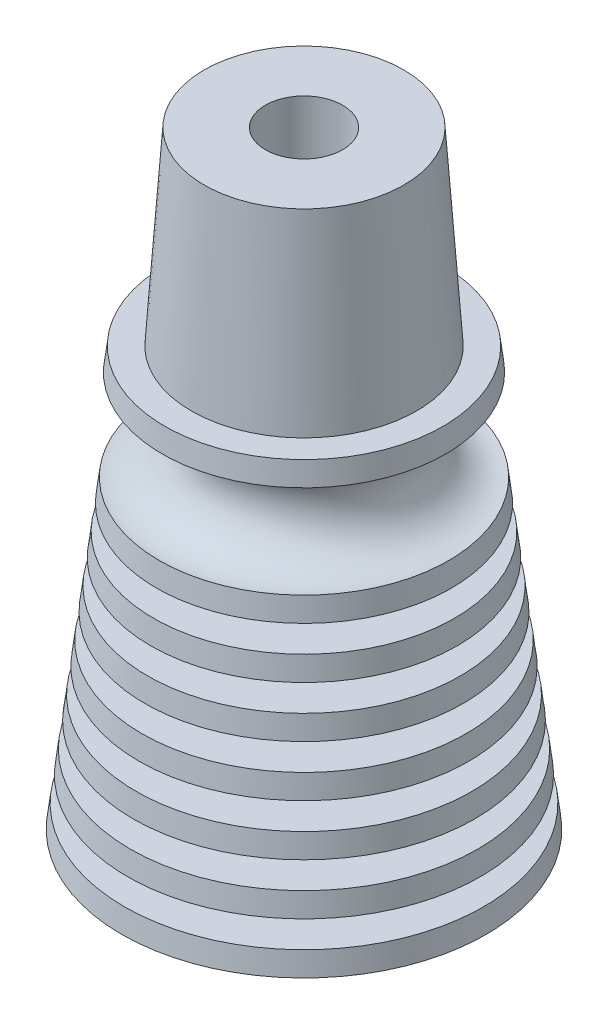
ISO-10303-21;
HEADER;
FILE_DESCRIPTION(('STEP AP214'),'2;1');
FILE_NAME('part.step','',(''),(''),'','','');
FILE_SCHEMA(('AUTOMOTIVE_DESIGN { 1 0 10303 214 1 1 1 1 }'));
ENDSEC;
DATA;
#1=APPLICATION_CONTEXT('core data for automotive mechanical design processes');
#2=APPLICATION_PROTOCOL_DEFINITION('international standard','automotive_design',2000,#1);
#3=PRODUCT_CONTEXT('',#1,'mechanical');
#4=PRODUCT('Part','Part','',(#3));
#5=PRODUCT_RELATED_PRODUCT_CATEGORY('part','',(#4));
#6=PRODUCT_DEFINITION_FORMATION('','',#4);
#7=PRODUCT_DEFINITION_CONTEXT('part definition',#1,'design');
#8=PRODUCT_DEFINITION('design','',#6,#7);
#9=PRODUCT_DEFINITION_SHAPE('','',#8);
#10=(LENGTH_UNIT() NAMED_UNIT(*) SI_UNIT(.MILLI.,.METRE.));
#11=(NAMED_UNIT(*) PLANE_ANGLE_UNIT() SI_UNIT($,.RADIAN.));
#12=(NAMED_UNIT(*) SI_UNIT($,.STERADIAN.) SOLID_ANGLE_UNIT());
#13=UNCERTAINTY_MEASURE_WITH_UNIT(LENGTH_MEASURE(1.E-05),#10,'distance_accuracy_value','');
#14=(GEOMETRIC_REPRESENTATION_CONTEXT(3) GLOBAL_UNCERTAINTY_ASSIGNED_CONTEXT((#13)) GLOBAL_UNIT_ASSIGNED_CONTEXT((#10,
#11,#12)) REPRESENTATION_CONTEXT('',''));
#15=CARTESIAN_POINT('',(0.,0.,0.));
#16=DIRECTION('',(0.,0.,1.));
#17=DIRECTION('',(1.,0.,0.));
#18=AXIS2_PLACEMENT_3D('',#15,#16,#17);
#19=CARTESIAN_POINT('',(0.,0.,0.));
#20=DIRECTION('',(0.,-1.,0.));
#21=DIRECTION('',(0.,0.,-1.));
#22=AXIS2_PLACEMENT_3D('',#19,#20,#21);
#23=PLANE('',#22);
#24=CARTESIAN_POINT('',(0.,0.,0.));
#25=DIRECTION('',(0.,1.,0.));
#26=DIRECTION('',(0.,0.,1.));
#27=AXIS2_PLACEMENT_3D('',#24,#25,#26);
#28=CIRCLE('',#27,1.9177);
#29=CARTESIAN_POINT('',(0.,0.,1.9177));
#30=VERTEX_POINT('',#29);
#31=EDGE_CURVE('E131',#30,#30,#28,.T.);
#32=ORIENTED_EDGE('',*,*,#31,.T.);
#33=EDGE_LOOP('',(#32));
#34=FACE_BOUND('',#33,.T.);
#35=CARTESIAN_POINT('',(0.,0.,0.));
#36=DIRECTION('',(0.,-1.,0.));
#37=DIRECTION('',(0.,0.,-1.));
#38=AXIS2_PLACEMENT_3D('',#35,#36,#37);
#39=CIRCLE('',#38,9.04875);
#40=CARTESIAN_POINT('',(0.,0.,-9.04875));
#41=VERTEX_POINT('',#40);
#42=EDGE_CURVE('E128',#41,#41,#39,.T.);
#43=ORIENTED_EDGE('',*,*,#42,.T.);
#44=EDGE_LOOP('',(#43));
#45=FACE_BOUND('',#44,.T.);
#46=ADVANCED_FACE('F34',(#34,#45),#23,.T.);
#47=CARTESIAN_POINT('',(4.953,30.1625,0.));
#48=DIRECTION('',(0.,1.,0.));
#49=DIRECTION('',(0.,0.,1.));
#50=AXIS2_PLACEMENT_3D('',#47,#48,#49);
#51=PLANE('',#50);
#52=CARTESIAN_POINT('',(0.,30.1625,0.));
#53=DIRECTION('',(0.,1.,0.));
#54=DIRECTION('',(0.,0.,1.));
#55=AXIS2_PLACEMENT_3D('',#52,#53,#54);
#56=CIRCLE('',#55,1.9177);
#57=CARTESIAN_POINT('',(0.,30.1625,1.9177));
#58=VERTEX_POINT('',#57);
#59=EDGE_CURVE('E132',#58,#58,#56,.T.);
#60=ORIENTED_EDGE('',*,*,#59,.F.);
#61=EDGE_LOOP('',(#60));
#62=FACE_BOUND('',#61,.T.);
#63=CARTESIAN_POINT('',(0.,30.1625,0.));
#64=DIRECTION('',(0.,-1.,0.));
#65=DIRECTION('',(0.,0.,-1.));
#66=AXIS2_PLACEMENT_3D('',#63,#64,#65);
#67=CIRCLE('',#66,4.953);
#68=CARTESIAN_POINT('',(0.,30.1625,-4.953));
#69=VERTEX_POINT('',#68);
#70=EDGE_CURVE('E10',#69,#69,#67,.T.);
#71=ORIENTED_EDGE('',*,*,#70,.F.);
#72=EDGE_LOOP('',(#71));
#73=FACE_BOUND('',#72,.T.);
#74=ADVANCED_FACE('F147',(#62,#73),#51,.T.);
#75=CARTESIAN_POINT('',(0.,20.7673307501192,0.));
#76=DIRECTION('',(0.,-1.,0.));
#77=DIRECTION('',(0.,0.,-1.));
#78=AXIS2_PLACEMENT_3D('',#75,#76,#77);
#79=CONICAL_SURFACE('',#78,5.588,0.0674852899793104);
#80=ORIENTED_EDGE('',*,*,#70,.T.);
#81=EDGE_LOOP('',(#80));
#82=FACE_BOUND('',#81,.T.);
#83=CARTESIAN_POINT('',(0.,20.7673307501192,0.));
#84=DIRECTION('',(0.,-1.,0.));
#85=DIRECTION('',(0.,0.,-1.));
#86=AXIS2_PLACEMENT_3D('',#83,#84,#85);
#87=CIRCLE('',#86,5.588);
#88=CARTESIAN_POINT('',(0.,20.7673307501192,-5.588));
#89=VERTEX_POINT('',#88);
#90=EDGE_CURVE('E40',#89,#89,#87,.T.);
#91=ORIENTED_EDGE('',*,*,#90,.F.);
#92=EDGE_LOOP('',(#91));
#93=FACE_BOUND('',#92,.T.);
#94=ADVANCED_FACE('F150',(#82,#93),#79,.T.);
#95=CARTESIAN_POINT('',(6.904482,20.7673307501192,0.));
#96=DIRECTION('',(0.,1.,0.));
#97=DIRECTION('',(0.,0.,1.));
#98=AXIS2_PLACEMENT_3D('',#95,#96,#97);
#99=PLANE('',#98);
#100=ORIENTED_EDGE('',*,*,#90,.T.);
#101=EDGE_LOOP('',(#100));
#102=FACE_BOUND('',#101,.T.);
#103=CARTESIAN_POINT('',(0.,20.7673307501192,0.));
#104=DIRECTION('',(0.,-1.,0.));
#105=DIRECTION('',(0.,0.,-1.));
#106=AXIS2_PLACEMENT_3D('',#103,#104,#105);
#107=CIRCLE('',#106,6.904482);
#108=CARTESIAN_POINT('',(0.,20.7673307501192,-6.904482));
#109=VERTEX_POINT('',#108);
#110=EDGE_CURVE('E44',#109,#109,#107,.T.);
#111=ORIENTED_EDGE('',*,*,#110,.F.);
#112=EDGE_LOOP('',(#111));
#113=FACE_BOUND('',#112,.T.);
#114=ADVANCED_FACE('F155',(#102,#113),#99,.T.);
#115=CARTESIAN_POINT('',(0.,19.6497307501192,0.));
#116=DIRECTION('',(0.,-1.,0.));
#117=DIRECTION('',(0.,0.,-1.));
#118=AXIS2_PLACEMENT_3D('',#115,#116,#117);
#119=CONICAL_SURFACE('',#118,7.04215,0.122564385974231);
#120=ORIENTED_EDGE('',*,*,#110,.T.);
#121=EDGE_LOOP('',(#120));
#122=FACE_BOUND('',#121,.T.);
#123=CARTESIAN_POINT('',(0.,19.6497307501192,0.));
#124=DIRECTION('',(0.,-1.,0.));
#125=DIRECTION('',(0.,0.,-1.));
#126=AXIS2_PLACEMENT_3D('',#123,#124,#125);
#127=CIRCLE('',#126,7.04215);
#128=CARTESIAN_POINT('',(0.,19.6497307501192,-7.04215));
#129=VERTEX_POINT('',#128);
#130=EDGE_CURVE('E48',#129,#129,#127,.T.);
#131=ORIENTED_EDGE('',*,*,#130,.F.);
#132=EDGE_LOOP('',(#131));
#133=FACE_BOUND('',#132,.T.);
#134=ADVANCED_FACE('F160',(#122,#133),#119,.T.);
#135=CARTESIAN_POINT('',(0.,17.3875846725058,0.));
#136=DIRECTION('',(0.,-1.,0.));
#137=DIRECTION('',(0.,0.,-1.));
#138=AXIS2_PLACEMENT_3D('',#135,#136,#137);
#139=TOROIDAL_SURFACE('',#138,6.90691570625042,2.26618472121483);
#140=ORIENTED_EDGE('',*,*,#130,.T.);
#141=EDGE_LOOP('',(#140));
#142=FACE_BOUND('',#141,.T.);
#143=CARTESIAN_POINT('',(0.,15.1384,0.));
#144=DIRECTION('',(0.,-1.,0.));
#145=DIRECTION('',(0.,0.,-1.));
#146=AXIS2_PLACEMENT_3D('',#143,#144,#145);
#147=CIRCLE('',#146,7.18397436363636);
#148=CARTESIAN_POINT('',(0.,15.1384,-7.18397436363636));
#149=VERTEX_POINT('',#148);
#150=EDGE_CURVE('E53',#149,#149,#147,.T.);
#151=ORIENTED_EDGE('',*,*,#150,.F.);
#152=EDGE_LOOP('',(#151));
#153=FACE_BOUND('',#152,.T.);
#154=ADVANCED_FACE('F163',(#142,#153),#139,.F.);
#155=CARTESIAN_POINT('',(0.,14.0208,0.));
#156=DIRECTION('',(0.,-1.,0.));
#157=DIRECTION('',(0.,0.,-1.));
#158=AXIS2_PLACEMENT_3D('',#155,#156,#157);
#159=CONICAL_SURFACE('',#158,7.32164236363636,0.12256438597423);
#160=ORIENTED_EDGE('',*,*,#150,.T.);
#161=EDGE_LOOP('',(#160));
#162=FACE_BOUND('',#161,.T.);
#163=CARTESIAN_POINT('',(0.,14.0208,0.));
#164=DIRECTION('',(0.,-1.,0.));
#165=DIRECTION('',(0.,0.,-1.));
#166=AXIS2_PLACEMENT_3D('',#163,#164,#165);
#167=CIRCLE('',#166,7.32164236363636);
#168=CARTESIAN_POINT('',(0.,14.0208,-7.32164236363636));
#169=VERTEX_POINT('',#168);
#170=EDGE_CURVE('E56',#169,#169,#167,.T.);
#171=ORIENTED_EDGE('',*,*,#170,.F.);
#172=EDGE_LOOP('',(#171));
#173=FACE_BOUND('',#172,.T.);
#174=ADVANCED_FACE('F167',(#162,#173),#159,.T.);
#175=CARTESIAN_POINT('',(4.62289236363636,14.0208,0.));
#176=DIRECTION('',(0.,-1.,0.));
#177=DIRECTION('',(0.,0.,-1.));
#178=AXIS2_PLACEMENT_3D('',#175,#176,#177);
#179=PLANE('',#178);
#180=ORIENTED_EDGE('',*,*,#170,.T.);
#181=EDGE_LOOP('',(#180));
#182=FACE_BOUND('',#181,.T.);
#183=CARTESIAN_POINT('',(0.,14.0208,0.));
#184=DIRECTION('',(0.,-1.,0.));
#185=DIRECTION('',(0.,0.,-1.));
#186=AXIS2_PLACEMENT_3D('',#183,#184,#185);
#187=CIRCLE('',#186,4.62289236363636);
#188=CARTESIAN_POINT('',(0.,14.0208,-4.62289236363636));
#189=VERTEX_POINT('',#188);
#190=EDGE_CURVE('E59',#189,#189,#187,.T.);
#191=ORIENTED_EDGE('',*,*,#190,.F.);
#192=EDGE_LOOP('',(#191));
#193=FACE_BOUND('',#192,.T.);
#194=ADVANCED_FACE('F171',(#182,#193),#179,.T.);
#195=CARTESIAN_POINT('',(0.,12.8016,0.));
#196=DIRECTION('',(0.,-1.,0.));
#197=DIRECTION('',(0.,0.,-1.));
#198=AXIS2_PLACEMENT_3D('',#195,#196,#197);
#199=CONICAL_SURFACE('',#198,4.77307563636364,0.122564385974232);
#200=ORIENTED_EDGE('',*,*,#190,.T.);
#201=EDGE_LOOP('',(#200));
#202=FACE_BOUND('',#201,.T.);
#203=CARTESIAN_POINT('',(0.,12.8016,0.));
#204=DIRECTION('',(0.,-1.,0.));
#205=DIRECTION('',(0.,0.,-1.));
#206=AXIS2_PLACEMENT_3D('',#203,#204,#205);
#207=CIRCLE('',#206,4.77307563636364);
#208=CARTESIAN_POINT('',(0.,12.8016,-4.77307563636364));
#209=VERTEX_POINT('',#208);
#210=EDGE_CURVE('E62',#209,#209,#207,.T.);
#211=ORIENTED_EDGE('',*,*,#210,.F.);
#212=EDGE_LOOP('',(#211));
#213=FACE_BOUND('',#212,.T.);
#214=ADVANCED_FACE('F175',(#202,#213),#199,.T.);
#215=CARTESIAN_POINT('',(7.47182563636364,12.8016,0.));
#216=DIRECTION('',(0.,1.,0.));
#217=DIRECTION('',(0.,0.,1.));
#218=AXIS2_PLACEMENT_3D('',#215,#216,#217);
#219=PLANE('',#218);
#220=ORIENTED_EDGE('',*,*,#210,.T.);
#221=EDGE_LOOP('',(#220));
#222=FACE_BOUND('',#221,.T.);
#223=CARTESIAN_POINT('',(0.,12.8016,0.));
#224=DIRECTION('',(0.,-1.,0.));
#225=DIRECTION('',(0.,0.,-1.));
#226=AXIS2_PLACEMENT_3D('',#223,#224,#225);
#227=CIRCLE('',#226,7.47182563636364);
#228=CARTESIAN_POINT('',(0.,12.8016,-7.47182563636364));
#229=VERTEX_POINT('',#228);
#230=EDGE_CURVE('E65',#229,#229,#227,.T.);
#231=ORIENTED_EDGE('',*,*,#230,.F.);
#232=EDGE_LOOP('',(#231));
#233=FACE_BOUND('',#232,.T.);
#234=ADVANCED_FACE('F179',(#222,#233),#219,.T.);
#235=CARTESIAN_POINT('',(0.,11.684,0.));
#236=DIRECTION('',(0.,-1.,0.));
#237=DIRECTION('',(0.,0.,-1.));
#238=AXIS2_PLACEMENT_3D('',#235,#236,#237);
#239=CONICAL_SURFACE('',#238,7.60949363636364,0.12256438597423);
#240=ORIENTED_EDGE('',*,*,#230,.T.);
#241=EDGE_LOOP('',(#240));
#242=FACE_BOUND('',#241,.T.);
#243=CARTESIAN_POINT('',(0.,11.684,0.));
#244=DIRECTION('',(0.,-1.,0.));
#245=DIRECTION('',(0.,0.,-1.));
#246=AXIS2_PLACEMENT_3D('',#243,#244,#245);
#247=CIRCLE('',#246,7.60949363636364);
#248=CARTESIAN_POINT('',(0.,11.684,-7.60949363636364));
#249=VERTEX_POINT('',#248);
#250=EDGE_CURVE('E68',#249,#249,#247,.T.);
#251=ORIENTED_EDGE('',*,*,#250,.F.);
#252=EDGE_LOOP('',(#251));
#253=FACE_BOUND('',#252,.T.);
#254=ADVANCED_FACE('F183',(#242,#253),#239,.T.);
#255=CARTESIAN_POINT('',(4.91074363636363,11.684,0.));
#256=DIRECTION('',(0.,-1.,0.));
#257=DIRECTION('',(0.,0.,-1.));
#258=AXIS2_PLACEMENT_3D('',#255,#256,#257);
#259=PLANE('',#258);
#260=ORIENTED_EDGE('',*,*,#250,.T.);
#261=EDGE_LOOP('',(#260));
#262=FACE_BOUND('',#261,.T.);
#263=CARTESIAN_POINT('',(0.,11.684,0.));
#264=DIRECTION('',(0.,-1.,0.));
#265=DIRECTION('',(0.,0.,-1.));
#266=AXIS2_PLACEMENT_3D('',#263,#264,#265);
#267=CIRCLE('',#266,4.91074363636363);
#268=CARTESIAN_POINT('',(0.,11.684,-4.91074363636363));
#269=VERTEX_POINT('',#268);
#270=EDGE_CURVE('E71',#269,#269,#267,.T.);
#271=ORIENTED_EDGE('',*,*,#270,.F.);
#272=EDGE_LOOP('',(#271));
#273=FACE_BOUND('',#272,.T.);
#274=ADVANCED_FACE('F187',(#262,#273),#259,.T.);
#275=CARTESIAN_POINT('',(0.,10.4648,0.));
#276=DIRECTION('',(0.,-1.,0.));
#277=DIRECTION('',(0.,0.,-1.));
#278=AXIS2_PLACEMENT_3D('',#275,#276,#277);
#279=CONICAL_SURFACE('',#278,5.06092690909091,0.122564385974232);
#280=ORIENTED_EDGE('',*,*,#270,.T.);
#281=EDGE_LOOP('',(#280));
#282=FACE_BOUND('',#281,.T.);
#283=CARTESIAN_POINT('',(0.,10.4648,0.));
#284=DIRECTION('',(0.,-1.,0.));
#285=DIRECTION('',(0.,0.,-1.));
#286=AXIS2_PLACEMENT_3D('',#283,#284,#285);
#287=CIRCLE('',#286,5.06092690909091);
#288=CARTESIAN_POINT('',(0.,10.4648,-5.06092690909091));
#289=VERTEX_POINT('',#288);
#290=EDGE_CURVE('E74',#289,#289,#287,.T.);
#291=ORIENTED_EDGE('',*,*,#290,.F.);
#292=EDGE_LOOP('',(#291));
#293=FACE_BOUND('',#292,.T.);
#294=ADVANCED_FACE('F191',(#282,#293),#279,.T.);
#295=CARTESIAN_POINT('',(7.75967690909091,10.4648,0.));
#296=DIRECTION('',(0.,1.,0.));
#297=DIRECTION('',(0.,0.,1.));
#298=AXIS2_PLACEMENT_3D('',#295,#296,#297);
#299=PLANE('',#298);
#300=ORIENTED_EDGE('',*,*,#290,.T.);
#301=EDGE_LOOP('',(#300));
#302=FACE_BOUND('',#301,.T.);
#303=CARTESIAN_POINT('',(0.,10.4648,0.));
#304=DIRECTION('',(0.,-1.,0.));
#305=DIRECTION('',(0.,0.,-1.));
#306=AXIS2_PLACEMENT_3D('',#303,#304,#305);
#307=CIRCLE('',#306,7.75967690909091);
#308=CARTESIAN_POINT('',(0.,10.4648,-7.75967690909091));
#309=VERTEX_POINT('',#308);
#310=EDGE_CURVE('E77',#309,#309,#307,.T.);
#311=ORIENTED_EDGE('',*,*,#310,.F.);
#312=EDGE_LOOP('',(#311));
#313=FACE_BOUND('',#312,.T.);
#314=ADVANCED_FACE('F195',(#302,#313),#299,.T.);
#315=CARTESIAN_POINT('',(0.,9.3472,0.));
#316=DIRECTION('',(0.,-1.,0.));
#317=DIRECTION('',(0.,0.,-1.));
#318=AXIS2_PLACEMENT_3D('',#315,#316,#317);
#319=CONICAL_SURFACE('',#318,7.89734490909091,0.122564385974231);
#320=ORIENTED_EDGE('',*,*,#310,.T.);
#321=EDGE_LOOP('',(#320));
#322=FACE_BOUND('',#321,.T.);
#323=CARTESIAN_POINT('',(0.,9.3472,0.));
#324=DIRECTION('',(0.,-1.,0.));
#325=DIRECTION('',(0.,0.,-1.));
#326=AXIS2_PLACEMENT_3D('',#323,#324,#325);
#327=CIRCLE('',#326,7.89734490909091);
#328=CARTESIAN_POINT('',(0.,9.3472,-7.89734490909091));
#329=VERTEX_POINT('',#328);
#330=EDGE_CURVE('E80',#329,#329,#327,.T.);
#331=ORIENTED_EDGE('',*,*,#330,.F.);
#332=EDGE_LOOP('',(#331));
#333=FACE_BOUND('',#332,.T.);
#334=ADVANCED_FACE('F199',(#322,#333),#319,.T.);
#335=CARTESIAN_POINT('',(5.19859490909091,9.3472,0.));
#336=DIRECTION('',(0.,-1.,0.));
#337=DIRECTION('',(0.,0.,-1.));
#338=AXIS2_PLACEMENT_3D('',#335,#336,#337);
#339=PLANE('',#338);
#340=ORIENTED_EDGE('',*,*,#330,.T.);
#341=EDGE_LOOP('',(#340));
#342=FACE_BOUND('',#341,.T.);
#343=CARTESIAN_POINT('',(0.,9.3472,0.));
#344=DIRECTION('',(0.,-1.,0.));
#345=DIRECTION('',(0.,0.,-1.));
#346=AXIS2_PLACEMENT_3D('',#343,#344,#345);
#347=CIRCLE('',#346,5.19859490909091);
#348=CARTESIAN_POINT('',(0.,9.3472,-5.19859490909091));
#349=VERTEX_POINT('',#348);
#350=EDGE_CURVE('E83',#349,#349,#347,.T.);
#351=ORIENTED_EDGE('',*,*,#350,.F.);
#352=EDGE_LOOP('',(#351));
#353=FACE_BOUND('',#352,.T.);
#354=ADVANCED_FACE('F203',(#342,#353),#339,.T.);
#355=CARTESIAN_POINT('',(0.,8.128,0.));
#356=DIRECTION('',(0.,-1.,0.));
#357=DIRECTION('',(0.,0.,-1.));
#358=AXIS2_PLACEMENT_3D('',#355,#356,#357);
#359=CONICAL_SURFACE('',#358,5.34877818181818,0.122564385974231);
#360=ORIENTED_EDGE('',*,*,#350,.T.);
#361=EDGE_LOOP('',(#360));
#362=FACE_BOUND('',#361,.T.);
#363=CARTESIAN_POINT('',(0.,8.128,0.));
#364=DIRECTION('',(0.,-1.,0.));
#365=DIRECTION('',(0.,0.,-1.));
#366=AXIS2_PLACEMENT_3D('',#363,#364,#365);
#367=CIRCLE('',#366,5.34877818181818);
#368=CARTESIAN_POINT('',(0.,8.128,-5.34877818181818));
#369=VERTEX_POINT('',#368);
#370=EDGE_CURVE('E86',#369,#369,#367,.T.);
#371=ORIENTED_EDGE('',*,*,#370,.F.);
#372=EDGE_LOOP('',(#371));
#373=FACE_BOUND('',#372,.T.);
#374=ADVANCED_FACE('F207',(#362,#373),#359,.T.);
#375=CARTESIAN_POINT('',(8.04752818181818,8.128,0.));
#376=DIRECTION('',(0.,1.,0.));
#377=DIRECTION('',(0.,0.,1.));
#378=AXIS2_PLACEMENT_3D('',#375,#376,#377);
#379=PLANE('',#378);
#380=ORIENTED_EDGE('',*,*,#370,.T.);
#381=EDGE_LOOP('',(#380));
#382=FACE_BOUND('',#381,.T.);
#383=CARTESIAN_POINT('',(0.,8.128,0.));
#384=DIRECTION('',(0.,-1.,0.));
#385=DIRECTION('',(0.,0.,-1.));
#386=AXIS2_PLACEMENT_3D('',#383,#384,#385);
#387=CIRCLE('',#386,8.04752818181818);
#388=CARTESIAN_POINT('',(0.,8.128,-8.04752818181818));
#389=VERTEX_POINT('',#388);
#390=EDGE_CURVE('E89',#389,#389,#387,.T.);
#391=ORIENTED_EDGE('',*,*,#390,.F.);
#392=EDGE_LOOP('',(#391));
#393=FACE_BOUND('',#392,.T.);
#394=ADVANCED_FACE('F211',(#382,#393),#379,.T.);
#395=CARTESIAN_POINT('',(0.,7.0104,0.));
#396=DIRECTION('',(0.,-1.,0.));
#397=DIRECTION('',(0.,0.,-1.));
#398=AXIS2_PLACEMENT_3D('',#395,#396,#397);
#399=CONICAL_SURFACE('',#398,8.18519618181818,0.122564385974233);
#400=ORIENTED_EDGE('',*,*,#390,.T.);
#401=EDGE_LOOP('',(#400));
#402=FACE_BOUND('',#401,.T.);
#403=CARTESIAN_POINT('',(0.,7.0104,0.));
#404=DIRECTION('',(0.,-1.,0.));
#405=DIRECTION('',(0.,0.,-1.));
#406=AXIS2_PLACEMENT_3D('',#403,#404,#405);
#407=CIRCLE('',#406,8.18519618181818);
#408=CARTESIAN_POINT('',(0.,7.0104,-8.18519618181818));
#409=VERTEX_POINT('',#408);
#410=EDGE_CURVE('E92',#409,#409,#407,.T.);
#411=ORIENTED_EDGE('',*,*,#410,.F.);
#412=EDGE_LOOP('',(#411));
#413=FACE_BOUND('',#412,.T.);
#414=ADVANCED_FACE('F215',(#402,#413),#399,.T.);
#415=CARTESIAN_POINT('',(5.48644618181818,7.0104,0.));
#416=DIRECTION('',(0.,-1.,0.));
#417=DIRECTION('',(0.,0.,-1.));
#418=AXIS2_PLACEMENT_3D('',#415,#416,#417);
#419=PLANE('',#418);
#420=ORIENTED_EDGE('',*,*,#410,.T.);
#421=EDGE_LOOP('',(#420));
#422=FACE_BOUND('',#421,.T.);
#423=CARTESIAN_POINT('',(0.,7.0104,0.));
#424=DIRECTION('',(0.,-1.,0.));
#425=DIRECTION('',(0.,0.,-1.));
#426=AXIS2_PLACEMENT_3D('',#423,#424,#425);
#427=CIRCLE('',#426,5.48644618181818);
#428=CARTESIAN_POINT('',(0.,7.0104,-5.48644618181818));
#429=VERTEX_POINT('',#428);
#430=EDGE_CURVE('E95',#429,#429,#427,.T.);
#431=ORIENTED_EDGE('',*,*,#430,.F.);
#432=EDGE_LOOP('',(#431));
#433=FACE_BOUND('',#432,.T.);
#434=ADVANCED_FACE('F219',(#422,#433),#419,.T.);
#435=CARTESIAN_POINT('',(0.,5.7912,0.));
#436=DIRECTION('',(0.,-1.,0.));
#437=DIRECTION('',(0.,0.,-1.));
#438=AXIS2_PLACEMENT_3D('',#435,#436,#437);
#439=CONICAL_SURFACE('',#438,5.63662945454545,0.122564385974231);
#440=ORIENTED_EDGE('',*,*,#430,.T.);
#441=EDGE_LOOP('',(#440));
#442=FACE_BOUND('',#441,.T.);
#443=CARTESIAN_POINT('',(0.,5.7912,0.));
#444=DIRECTION('',(0.,-1.,0.));
#445=DIRECTION('',(0.,0.,-1.));
#446=AXIS2_PLACEMENT_3D('',#443,#444,#445);
#447=CIRCLE('',#446,5.63662945454545);
#448=CARTESIAN_POINT('',(0.,5.7912,-5.63662945454545));
#449=VERTEX_POINT('',#448);
#450=EDGE_CURVE('E98',#449,#449,#447,.T.);
#451=ORIENTED_EDGE('',*,*,#450,.F.);
#452=EDGE_LOOP('',(#451));
#453=FACE_BOUND('',#452,.T.);
#454=ADVANCED_FACE('F223',(#442,#453),#439,.T.);
#455=CARTESIAN_POINT('',(8.33537945454545,5.7912,0.));
#456=DIRECTION('',(0.,1.,0.));
#457=DIRECTION('',(0.,0.,1.));
#458=AXIS2_PLACEMENT_3D('',#455,#456,#457);
#459=PLANE('',#458);
#460=ORIENTED_EDGE('',*,*,#450,.T.);
#461=EDGE_LOOP('',(#460));
#462=FACE_BOUND('',#461,.T.);
#463=CARTESIAN_POINT('',(0.,5.7912,0.));
#464=DIRECTION('',(0.,-1.,0.));
#465=DIRECTION('',(0.,0.,-1.));
#466=AXIS2_PLACEMENT_3D('',#463,#464,#465);
#467=CIRCLE('',#466,8.33537945454545);
#468=CARTESIAN_POINT('',(0.,5.7912,-8.33537945454545));
#469=VERTEX_POINT('',#468);
#470=EDGE_CURVE('E101',#469,#469,#467,.T.);
#471=ORIENTED_EDGE('',*,*,#470,.F.);
#472=EDGE_LOOP('',(#471));
#473=FACE_BOUND('',#472,.T.);
#474=ADVANCED_FACE('F227',(#462,#473),#459,.T.);
#475=CARTESIAN_POINT('',(0.,4.6736,0.));
#476=DIRECTION('',(0.,-1.,0.));
#477=DIRECTION('',(0.,0.,-1.));
#478=AXIS2_PLACEMENT_3D('',#475,#476,#477);
#479=CONICAL_SURFACE('',#478,8.47304745454545,0.122564385974232);
#480=ORIENTED_EDGE('',*,*,#470,.T.);
#481=EDGE_LOOP('',(#480));
#482=FACE_BOUND('',#481,.T.);
#483=CARTESIAN_POINT('',(0.,4.6736,0.));
#484=DIRECTION('',(0.,-1.,0.));
#485=DIRECTION('',(0.,0.,-1.));
#486=AXIS2_PLACEMENT_3D('',#483,#484,#485);
#487=CIRCLE('',#486,8.47304745454545);
#488=CARTESIAN_POINT('',(0.,4.6736,-8.47304745454545));
#489=VERTEX_POINT('',#488);
#490=EDGE_CURVE('E104',#489,#489,#487,.T.);
#491=ORIENTED_EDGE('',*,*,#490,.F.);
#492=EDGE_LOOP('',(#491));
#493=FACE_BOUND('',#492,.T.);
#494=ADVANCED_FACE('F231',(#482,#493),#479,.T.);
#495=CARTESIAN_POINT('',(5.77429745454545,4.6736,0.));
#496=DIRECTION('',(0.,-1.,0.));
#497=DIRECTION('',(0.,0.,-1.));
#498=AXIS2_PLACEMENT_3D('',#495,#496,#497);
#499=PLANE('',#498);
#500=ORIENTED_EDGE('',*,*,#490,.T.);
#501=EDGE_LOOP('',(#500));
#502=FACE_BOUND('',#501,.T.);
#503=CARTESIAN_POINT('',(0.,4.6736,0.));
#504=DIRECTION('',(0.,-1.,0.));
#505=DIRECTION('',(0.,0.,-1.));
#506=AXIS2_PLACEMENT_3D('',#503,#504,#505);
#507=CIRCLE('',#506,5.77429745454545);
#508=CARTESIAN_POINT('',(0.,4.6736,-5.77429745454545));
#509=VERTEX_POINT('',#508);
#510=EDGE_CURVE('E107',#509,#509,#507,.T.);
#511=ORIENTED_EDGE('',*,*,#510,.F.);
#512=EDGE_LOOP('',(#511));
#513=FACE_BOUND('',#512,.T.);
#514=ADVANCED_FACE('F235',(#502,#513),#499,.T.);
#515=CARTESIAN_POINT('',(0.,3.4544,0.));
#516=DIRECTION('',(0.,-1.,0.));
#517=DIRECTION('',(0.,0.,-1.));
#518=AXIS2_PLACEMENT_3D('',#515,#516,#517);
#519=CONICAL_SURFACE('',#518,5.92448072727273,0.122564385974232);
#520=ORIENTED_EDGE('',*,*,#510,.T.);
#521=EDGE_LOOP('',(#520));
#522=FACE_BOUND('',#521,.T.);
#523=CARTESIAN_POINT('',(0.,3.4544,0.));
#524=DIRECTION('',(0.,-1.,0.));
#525=DIRECTION('',(0.,0.,-1.));
#526=AXIS2_PLACEMENT_3D('',#523,#524,#525);
#527=CIRCLE('',#526,5.92448072727273);
#528=CARTESIAN_POINT('',(0.,3.4544,-5.92448072727273));
#529=VERTEX_POINT('',#528);
#530=EDGE_CURVE('E110',#529,#529,#527,.T.);
#531=ORIENTED_EDGE('',*,*,#530,.F.);
#532=EDGE_LOOP('',(#531));
#533=FACE_BOUND('',#532,.T.);
#534=ADVANCED_FACE('F239',(#522,#533),#519,.T.);
#535=CARTESIAN_POINT('',(8.62323072727273,3.4544,0.));
#536=DIRECTION('',(0.,1.,0.));
#537=DIRECTION('',(0.,0.,1.));
#538=AXIS2_PLACEMENT_3D('',#535,#536,#537);
#539=PLANE('',#538);
#540=ORIENTED_EDGE('',*,*,#530,.T.);
#541=EDGE_LOOP('',(#540));
#542=FACE_BOUND('',#541,.T.);
#543=CARTESIAN_POINT('',(0.,3.4544,0.));
#544=DIRECTION('',(0.,-1.,0.));
#545=DIRECTION('',(0.,0.,-1.));
#546=AXIS2_PLACEMENT_3D('',#543,#544,#545);
#547=CIRCLE('',#546,8.62323072727273);
#548=CARTESIAN_POINT('',(0.,3.4544,-8.62323072727273));
#549=VERTEX_POINT('',#548);
#550=EDGE_CURVE('E113',#549,#549,#547,.T.);
#551=ORIENTED_EDGE('',*,*,#550,.F.);
#552=EDGE_LOOP('',(#551));
#553=FACE_BOUND('',#552,.T.);
#554=ADVANCED_FACE('F243',(#542,#553),#539,.T.);
#555=CARTESIAN_POINT('',(0.,2.3368,0.));
#556=DIRECTION('',(0.,-1.,0.));
#557=DIRECTION('',(0.,0.,-1.));
#558=AXIS2_PLACEMENT_3D('',#555,#556,#557);
#559=CONICAL_SURFACE('',#558,8.76089872727273,0.122564385974233);
#560=ORIENTED_EDGE('',*,*,#550,.T.);
#561=EDGE_LOOP('',(#560));
#562=FACE_BOUND('',#561,.T.);
#563=CARTESIAN_POINT('',(0.,2.3368,0.));
#564=DIRECTION('',(0.,-1.,0.));
#565=DIRECTION('',(0.,0.,-1.));
#566=AXIS2_PLACEMENT_3D('',#563,#564,#565);
#567=CIRCLE('',#566,8.76089872727273);
#568=CARTESIAN_POINT('',(0.,2.3368,-8.76089872727273));
#569=VERTEX_POINT('',#568);
#570=EDGE_CURVE('E116',#569,#569,#567,.T.);
#571=ORIENTED_EDGE('',*,*,#570,.F.);
#572=EDGE_LOOP('',(#571));
#573=FACE_BOUND('',#572,.T.);
#574=ADVANCED_FACE('F247',(#562,#573),#559,.T.);
#575=CARTESIAN_POINT('',(6.06214872727273,2.3368,0.));
#576=DIRECTION('',(0.,-1.,0.));
#577=DIRECTION('',(0.,0.,-1.));
#578=AXIS2_PLACEMENT_3D('',#575,#576,#577);
#579=PLANE('',#578);
#580=ORIENTED_EDGE('',*,*,#570,.T.);
#581=EDGE_LOOP('',(#580));
#582=FACE_BOUND('',#581,.T.);
#583=CARTESIAN_POINT('',(0.,2.3368,0.));
#584=DIRECTION('',(0.,-1.,0.));
#585=DIRECTION('',(0.,0.,-1.));
#586=AXIS2_PLACEMENT_3D('',#583,#584,#585);
#587=CIRCLE('',#586,6.06214872727273);
#588=CARTESIAN_POINT('',(0.,2.3368,-6.06214872727273));
#589=VERTEX_POINT('',#588);
#590=EDGE_CURVE('E119',#589,#589,#587,.T.);
#591=ORIENTED_EDGE('',*,*,#590,.F.);
#592=EDGE_LOOP('',(#591));
#593=FACE_BOUND('',#592,.T.);
#594=ADVANCED_FACE('F251',(#582,#593),#579,.T.);
#595=CARTESIAN_POINT('',(0.,1.1176,0.));
#596=DIRECTION('',(0.,-1.,0.));
#597=DIRECTION('',(0.,0.,-1.));
#598=AXIS2_PLACEMENT_3D('',#595,#596,#597);
#599=CONICAL_SURFACE('',#598,6.212332,0.122564385974231);
#600=ORIENTED_EDGE('',*,*,#590,.T.);
#601=EDGE_LOOP('',(#600));
#602=FACE_BOUND('',#601,.T.);
#603=CARTESIAN_POINT('',(0.,1.1176,0.));
#604=DIRECTION('',(0.,-1.,0.));
#605=DIRECTION('',(0.,0.,-1.));
#606=AXIS2_PLACEMENT_3D('',#603,#604,#605);
#607=CIRCLE('',#606,6.212332);
#608=CARTESIAN_POINT('',(0.,1.1176,-6.212332));
#609=VERTEX_POINT('',#608);
#610=EDGE_CURVE('E122',#609,#609,#607,.T.);
#611=ORIENTED_EDGE('',*,*,#610,.F.);
#612=EDGE_LOOP('',(#611));
#613=FACE_BOUND('',#612,.T.);
#614=ADVANCED_FACE('F255',(#602,#613),#599,.T.);
#615=CARTESIAN_POINT('',(8.911082,1.1176,0.));
#616=DIRECTION('',(0.,1.,0.));
#617=DIRECTION('',(0.,0.,1.));
#618=AXIS2_PLACEMENT_3D('',#615,#616,#617);
#619=PLANE('',#618);
#620=ORIENTED_EDGE('',*,*,#610,.T.);
#621=EDGE_LOOP('',(#620));
#622=FACE_BOUND('',#621,.T.);
#623=CARTESIAN_POINT('',(0.,1.1176,0.));
#624=DIRECTION('',(0.,-1.,0.));
#625=DIRECTION('',(0.,0.,-1.));
#626=AXIS2_PLACEMENT_3D('',#623,#624,#625);
#627=CIRCLE('',#626,8.911082);
#628=CARTESIAN_POINT('',(0.,1.1176,-8.911082));
#629=VERTEX_POINT('',#628);
#630=EDGE_CURVE('E125',#629,#629,#627,.T.);
#631=ORIENTED_EDGE('',*,*,#630,.F.);
#632=EDGE_LOOP('',(#631));
#633=FACE_BOUND('',#632,.T.);
#634=ADVANCED_FACE('F259',(#622,#633),#619,.T.);
#635=CARTESIAN_POINT('',(0.,0.,0.));
#636=DIRECTION('',(0.,-1.,0.));
#637=DIRECTION('',(0.,0.,-1.));
#638=AXIS2_PLACEMENT_3D('',#635,#636,#637);
#639=CONICAL_SURFACE('',#638,9.04875,0.122564385974232);
#640=ORIENTED_EDGE('',*,*,#630,.T.);
#641=EDGE_LOOP('',(#640));
#642=FACE_BOUND('',#641,.T.);
#643=ORIENTED_EDGE('',*,*,#42,.F.);
#644=EDGE_LOOP('',(#643));
#645=FACE_BOUND('',#644,.T.);
#646=ADVANCED_FACE('F143',(#642,#645),#639,.T.);
#647=CARTESIAN_POINT('',(0.,0.,0.));
#648=DIRECTION('',(0.,1.,0.));
#649=DIRECTION('',(0.,0.,1.));
#650=AXIS2_PLACEMENT_3D('',#647,#648,#649);
#651=CYLINDRICAL_SURFACE('',#650,1.9177);
#652=ORIENTED_EDGE('',*,*,#31,.F.);
#653=EDGE_LOOP('',(#652));
#654=FACE_BOUND('',#653,.T.);
#655=ORIENTED_EDGE('',*,*,#59,.T.);
#656=EDGE_LOOP('',(#655));
#657=FACE_BOUND('',#656,.T.);
#658=ADVANCED_FACE('F140',(#654,#657),#651,.F.);
#659=CLOSED_SHELL('',(#46,#74,#94,#114,#134,#154,#174,#194,#214,#234,#254,#274,#294,#314,#334,
#354,#374,#394,#414,#434,#454,#474,#494,#514,#534,#554,#574,#594,#614,#634,#646,#658));
#660=MANIFOLD_SOLID_BREP('B2',#659);
#661=ADVANCED_BREP_SHAPE_REPRESENTATION('',(#18,#660),#14);
#662=SHAPE_DEFINITION_REPRESENTATION(#9,#661);
ENDSEC;
END-ISO-10303-21;
